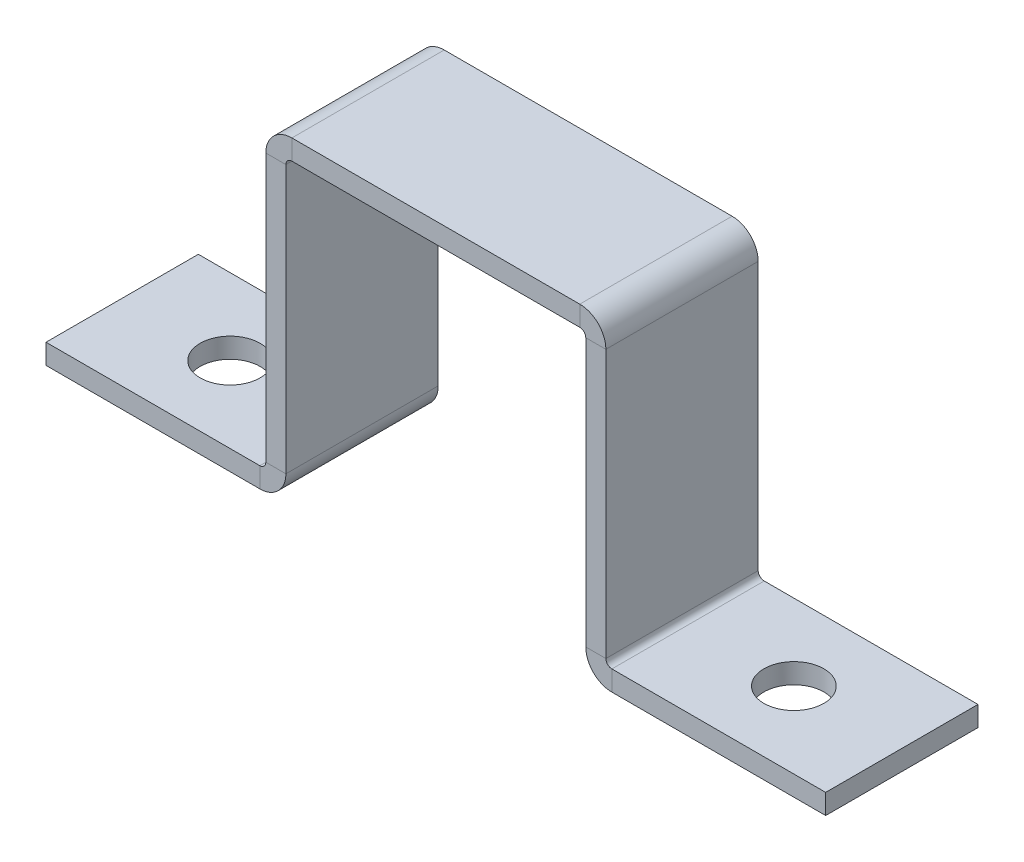
ISO-10303-21;
HEADER;
FILE_DESCRIPTION(('STEP AP214'),'2;1');
FILE_NAME('part.step','',(''),(''),'','','');
FILE_SCHEMA(('AUTOMOTIVE_DESIGN { 1 0 10303 214 1 1 1 1 }'));
ENDSEC;
DATA;
#1=APPLICATION_CONTEXT('core data for automotive mechanical design processes');
#2=APPLICATION_PROTOCOL_DEFINITION('international standard','automotive_design',2000,#1);
#3=PRODUCT_CONTEXT('',#1,'mechanical');
#4=PRODUCT('Part','Part','',(#3));
#5=PRODUCT_RELATED_PRODUCT_CATEGORY('part','',(#4));
#6=PRODUCT_DEFINITION_FORMATION('','',#4);
#7=PRODUCT_DEFINITION_CONTEXT('part definition',#1,'design');
#8=PRODUCT_DEFINITION('design','',#6,#7);
#9=PRODUCT_DEFINITION_SHAPE('','',#8);
#10=(LENGTH_UNIT() NAMED_UNIT(*) SI_UNIT(.MILLI.,.METRE.));
#11=(NAMED_UNIT(*) PLANE_ANGLE_UNIT() SI_UNIT($,.RADIAN.));
#12=(NAMED_UNIT(*) SI_UNIT($,.STERADIAN.) SOLID_ANGLE_UNIT());
#13=UNCERTAINTY_MEASURE_WITH_UNIT(LENGTH_MEASURE(1.E-05),#10,'distance_accuracy_value','');
#14=(GEOMETRIC_REPRESENTATION_CONTEXT(3) GLOBAL_UNCERTAINTY_ASSIGNED_CONTEXT((#13)) GLOBAL_UNIT_ASSIGNED_CONTEXT((#10,
#11,#12)) REPRESENTATION_CONTEXT('',''));
#15=CARTESIAN_POINT('',(0.,0.,0.));
#16=DIRECTION('',(0.,0.,1.));
#17=DIRECTION('',(1.,0.,0.));
#18=AXIS2_PLACEMENT_3D('',#15,#16,#17);
#19=CARTESIAN_POINT('',(29.3500000000001,0.,-12.7));
#20=DIRECTION('',(0.,0.,-1.));
#21=DIRECTION('',(-1.,0.,0.));
#22=AXIS2_PLACEMENT_3D('',#19,#20,#21);
#23=PLANE('',#22);
#24=DIRECTION('',(0.,1.,0.));
#25=VECTOR('',#24,1.);
#26=CARTESIAN_POINT('',(29.3500000000001,0.,-12.7));
#27=LINE('',#26,#25);
#28=CARTESIAN_POINT('',(29.3500000000001,0.,-12.7));
#29=VERTEX_POINT('',#28);
#30=CARTESIAN_POINT('',(29.3500000000001,3.35000000000001,-12.7));
#31=VERTEX_POINT('',#30);
#32=EDGE_CURVE('E11',#29,#31,#27,.T.);
#33=ORIENTED_EDGE('',*,*,#32,.F.);
#34=CARTESIAN_POINT('',(29.3500000000001,4.35000000000001,-12.7));
#35=DIRECTION('',(0.,0.,1.));
#36=DIRECTION('',(1.,0.,0.));
#37=AXIS2_PLACEMENT_3D('',#34,#35,#36);
#38=CIRCLE('',#37,4.35);
#39=CARTESIAN_POINT('',(25.0000000000001,4.35000000000002,-12.7));
#40=VERTEX_POINT('',#39);
#41=EDGE_CURVE('E366',#29,#40,#38,.F.);
#42=ORIENTED_EDGE('',*,*,#41,.T.);
#43=DIRECTION('',(-1.,0.,0.));
#44=VECTOR('',#43,1.);
#45=CARTESIAN_POINT('',(28.3500000000001,4.34999999999991,-12.7));
#46=LINE('',#45,#44);
#47=CARTESIAN_POINT('',(28.3500000000001,4.34999999999991,-12.7));
#48=VERTEX_POINT('',#47);
#49=EDGE_CURVE('E42',#48,#40,#46,.T.);
#50=ORIENTED_EDGE('',*,*,#49,.F.);
#51=CARTESIAN_POINT('',(29.3500000000001,4.35000000000001,-12.7));
#52=DIRECTION('',(0.,0.,1.));
#53=DIRECTION('',(1.,0.,0.));
#54=AXIS2_PLACEMENT_3D('',#51,#52,#53);
#55=CIRCLE('',#54,1.);
#56=EDGE_CURVE('E391',#31,#48,#55,.F.);
#57=ORIENTED_EDGE('',*,*,#56,.F.);
#58=EDGE_LOOP('',(#33,#42,#50,#57));
#59=FACE_BOUND('',#58,.T.);
#60=ADVANCED_FACE('F34',(#59),#23,.T.);
#61=CARTESIAN_POINT('',(28.3500000000001,4.34999999999991,-12.7));
#62=DIRECTION('',(0.,0.,-1.));
#63=DIRECTION('',(-1.,0.,0.));
#64=AXIS2_PLACEMENT_3D('',#61,#62,#63);
#65=PLANE('',#64);
#66=DIRECTION('',(-1.,0.,0.));
#67=VECTOR('',#66,1.);
#68=CARTESIAN_POINT('',(25.0000000000001,0.,-12.7));
#69=LINE('',#68,#67);
#70=CARTESIAN_POINT('',(65.0000000000003,0.,-12.7));
#71=VERTEX_POINT('',#70);
#72=EDGE_CURVE('E370',#71,#29,#69,.T.);
#73=ORIENTED_EDGE('',*,*,#72,.T.);
#74=ORIENTED_EDGE('',*,*,#32,.T.);
#75=DIRECTION('',(-1.,0.,0.));
#76=VECTOR('',#75,1.);
#77=CARTESIAN_POINT('',(25.0000000000001,3.34999999999999,-12.7));
#78=LINE('',#77,#76);
#79=CARTESIAN_POINT('',(65.0000000000001,3.35000000000001,-12.7));
#80=VERTEX_POINT('',#79);
#81=EDGE_CURVE('E388',#80,#31,#78,.T.);
#82=ORIENTED_EDGE('',*,*,#81,.F.);
#83=DIRECTION('',(0.,-1.,0.));
#84=VECTOR('',#83,1.);
#85=CARTESIAN_POINT('',(65.0000000000001,3.35000000000001,-12.7));
#86=LINE('',#85,#84);
#87=EDGE_CURVE('E386',#80,#71,#86,.T.);
#88=ORIENTED_EDGE('',*,*,#87,.T.);
#89=EDGE_LOOP('',(#73,#74,#82,#88));
#90=FACE_BOUND('',#89,.T.);
#91=ADVANCED_FACE('F416',(#90),#65,.T.);
#92=CARTESIAN_POINT('',(25.0000000000001,4.35000000000002,12.7));
#93=DIRECTION('',(0.,0.,1.));
#94=DIRECTION('',(1.,0.,0.));
#95=AXIS2_PLACEMENT_3D('',#92,#93,#94);
#96=PLANE('',#95);
#97=DIRECTION('',(1.,0.,0.));
#98=VECTOR('',#97,1.);
#99=CARTESIAN_POINT('',(25.0000000000001,4.35000000000002,12.7));
#100=LINE('',#99,#98);
#101=CARTESIAN_POINT('',(25.0000000000001,4.35000000000002,12.7));
#102=VERTEX_POINT('',#101);
#103=CARTESIAN_POINT('',(28.3500000000001,4.34999999999991,12.7));
#104=VERTEX_POINT('',#103);
#105=EDGE_CURVE('E350',#102,#104,#100,.T.);
#106=ORIENTED_EDGE('',*,*,#105,.F.);
#107=CARTESIAN_POINT('',(29.3500000000001,4.35000000000013,12.7));
#108=DIRECTION('',(0.,0.,1.));
#109=DIRECTION('',(1.,0.,0.));
#110=AXIS2_PLACEMENT_3D('',#107,#108,#109);
#111=CIRCLE('',#110,4.35);
#112=CARTESIAN_POINT('',(29.3500000000001,1.2490009027033E-13,12.7));
#113=VERTEX_POINT('',#112);
#114=EDGE_CURVE('E254',#113,#102,#111,.F.);
#115=ORIENTED_EDGE('',*,*,#114,.F.);
#116=DIRECTION('',(0.,-1.,0.));
#117=VECTOR('',#116,1.);
#118=CARTESIAN_POINT('',(29.3500000000001,3.35000000000013,12.7));
#119=LINE('',#118,#117);
#120=CARTESIAN_POINT('',(29.3500000000001,3.35000000000013,12.7));
#121=VERTEX_POINT('',#120);
#122=EDGE_CURVE('E348',#121,#113,#119,.T.);
#123=ORIENTED_EDGE('',*,*,#122,.F.);
#124=CARTESIAN_POINT('',(29.3500000000001,4.35000000000013,12.7));
#125=DIRECTION('',(0.,0.,1.));
#126=DIRECTION('',(1.,0.,0.));
#127=AXIS2_PLACEMENT_3D('',#124,#125,#126);
#128=CIRCLE('',#127,1.);
#129=EDGE_CURVE('E265',#121,#104,#128,.F.);
#130=ORIENTED_EDGE('',*,*,#129,.T.);
#131=EDGE_LOOP('',(#106,#115,#123,#130));
#132=FACE_BOUND('',#131,.T.);
#133=ADVANCED_FACE('F424',(#132),#96,.T.);
#134=CARTESIAN_POINT('',(29.3500000000001,3.35000000000013,12.7));
#135=DIRECTION('',(0.,0.,1.));
#136=DIRECTION('',(1.,0.,0.));
#137=AXIS2_PLACEMENT_3D('',#134,#135,#136);
#138=PLANE('',#137);
#139=DIRECTION('',(0.,1.,0.));
#140=VECTOR('',#139,1.);
#141=CARTESIAN_POINT('',(25.0000000000001,50.,12.7));
#142=LINE('',#141,#140);
#143=CARTESIAN_POINT('',(25.0000000000001,49.,12.7));
#144=VERTEX_POINT('',#143);
#145=EDGE_CURVE('E251',#102,#144,#142,.T.);
#146=ORIENTED_EDGE('',*,*,#145,.F.);
#147=ORIENTED_EDGE('',*,*,#105,.T.);
#148=DIRECTION('',(0.,1.,0.));
#149=VECTOR('',#148,1.);
#150=CARTESIAN_POINT('',(28.3500000000001,50.,12.7));
#151=LINE('',#150,#149);
#152=CARTESIAN_POINT('',(28.3500000000001,49.,12.7));
#153=VERTEX_POINT('',#152);
#154=EDGE_CURVE('E268',#104,#153,#151,.T.);
#155=ORIENTED_EDGE('',*,*,#154,.T.);
#156=DIRECTION('',(-1.,0.,0.));
#157=VECTOR('',#156,1.);
#158=CARTESIAN_POINT('',(28.3500000000001,49.,12.7));
#159=LINE('',#158,#157);
#160=EDGE_CURVE('E340',#153,#144,#159,.T.);
#161=ORIENTED_EDGE('',*,*,#160,.T.);
#162=EDGE_LOOP('',(#146,#147,#155,#161));
#163=FACE_BOUND('',#162,.T.);
#164=ADVANCED_FACE('F426',(#163),#138,.T.);
#165=CARTESIAN_POINT('',(25.0000000000001,49.,-12.7));
#166=DIRECTION('',(0.,0.,-1.));
#167=DIRECTION('',(-1.,0.,0.));
#168=AXIS2_PLACEMENT_3D('',#165,#166,#167);
#169=PLANE('',#168);
#170=DIRECTION('',(1.,0.,0.));
#171=VECTOR('',#170,1.);
#172=CARTESIAN_POINT('',(25.0000000000001,49.,-12.7));
#173=LINE('',#172,#171);
#174=CARTESIAN_POINT('',(25.0000000000001,49.,-12.7));
#175=VERTEX_POINT('',#174);
#176=CARTESIAN_POINT('',(28.3500000000001,49.,-12.7));
#177=VERTEX_POINT('',#176);
#178=EDGE_CURVE('E346',#175,#177,#173,.T.);
#179=ORIENTED_EDGE('',*,*,#178,.F.);
#180=CARTESIAN_POINT('',(24.0000000000001,49.,-12.7));
#181=DIRECTION('',(0.,0.,-1.));
#182=DIRECTION('',(-1.,0.,0.));
#183=AXIS2_PLACEMENT_3D('',#180,#181,#182);
#184=CIRCLE('',#183,1.);
#185=CARTESIAN_POINT('',(24.0000000000001,50.,-12.7));
#186=VERTEX_POINT('',#185);
#187=EDGE_CURVE('E378',#175,#186,#184,.F.);
#188=ORIENTED_EDGE('',*,*,#187,.T.);
#189=DIRECTION('',(0.,-1.,0.));
#190=VECTOR('',#189,1.);
#191=CARTESIAN_POINT('',(24.0000000000001,53.35,-12.7));
#192=LINE('',#191,#190);
#193=CARTESIAN_POINT('',(24.0000000000001,53.35,-12.7));
#194=VERTEX_POINT('',#193);
#195=EDGE_CURVE('E344',#194,#186,#192,.T.);
#196=ORIENTED_EDGE('',*,*,#195,.F.);
#197=CARTESIAN_POINT('',(24.0000000000001,49.,-12.7));
#198=DIRECTION('',(0.,0.,1.));
#199=DIRECTION('',(1.,0.,0.));
#200=AXIS2_PLACEMENT_3D('',#197,#198,#199);
#201=CIRCLE('',#200,4.35);
#202=EDGE_CURVE('E221',#177,#194,#201,.T.);
#203=ORIENTED_EDGE('',*,*,#202,.F.);
#204=EDGE_LOOP('',(#179,#188,#196,#203));
#205=FACE_BOUND('',#204,.T.);
#206=ADVANCED_FACE('F402',(#205),#169,.T.);
#207=CARTESIAN_POINT('',(24.0000000000001,53.35,-12.7));
#208=DIRECTION('',(0.,0.,-1.));
#209=DIRECTION('',(-1.,0.,0.));
#210=AXIS2_PLACEMENT_3D('',#207,#208,#209);
#211=PLANE('',#210);
#212=DIRECTION('',(0.,1.,0.));
#213=VECTOR('',#212,1.);
#214=CARTESIAN_POINT('',(25.0000000000001,50.,-12.7));
#215=LINE('',#214,#213);
#216=EDGE_CURVE('E357',#40,#175,#215,.T.);
#217=ORIENTED_EDGE('',*,*,#216,.T.);
#218=ORIENTED_EDGE('',*,*,#178,.T.);
#219=DIRECTION('',(0.,1.,0.));
#220=VECTOR('',#219,1.);
#221=CARTESIAN_POINT('',(28.3500000000001,50.,-12.7));
#222=LINE('',#221,#220);
#223=EDGE_CURVE('E360',#48,#177,#222,.T.);
#224=ORIENTED_EDGE('',*,*,#223,.F.);
#225=ORIENTED_EDGE('',*,*,#49,.T.);
#226=EDGE_LOOP('',(#217,#218,#224,#225));
#227=FACE_BOUND('',#226,.T.);
#228=ADVANCED_FACE('F355',(#227),#211,.T.);
#229=CARTESIAN_POINT('',(24.0000000000001,50.,12.7));
#230=DIRECTION('',(0.,0.,1.));
#231=DIRECTION('',(1.,0.,0.));
#232=AXIS2_PLACEMENT_3D('',#229,#230,#231);
#233=PLANE('',#232);
#234=DIRECTION('',(0.,1.,0.));
#235=VECTOR('',#234,1.);
#236=CARTESIAN_POINT('',(24.0000000000001,50.,12.7));
#237=LINE('',#236,#235);
#238=CARTESIAN_POINT('',(24.0000000000001,50.,12.7));
#239=VERTEX_POINT('',#238);
#240=CARTESIAN_POINT('',(24.0000000000001,53.35,12.7));
#241=VERTEX_POINT('',#240);
#242=EDGE_CURVE('E342',#239,#241,#237,.T.);
#243=ORIENTED_EDGE('',*,*,#242,.F.);
#244=CARTESIAN_POINT('',(24.0000000000001,49.,12.7));
#245=DIRECTION('',(0.,0.,-1.));
#246=DIRECTION('',(-1.,0.,0.));
#247=AXIS2_PLACEMENT_3D('',#244,#245,#246);
#248=CIRCLE('',#247,1.);
#249=EDGE_CURVE('E248',#144,#239,#248,.F.);
#250=ORIENTED_EDGE('',*,*,#249,.F.);
#251=ORIENTED_EDGE('',*,*,#160,.F.);
#252=CARTESIAN_POINT('',(24.0000000000001,49.,12.7));
#253=DIRECTION('',(0.,0.,1.));
#254=DIRECTION('',(1.,0.,0.));
#255=AXIS2_PLACEMENT_3D('',#252,#253,#254);
#256=CIRCLE('',#255,4.35);
#257=EDGE_CURVE('E271',#153,#241,#256,.T.);
#258=ORIENTED_EDGE('',*,*,#257,.T.);
#259=EDGE_LOOP('',(#243,#250,#251,#258));
#260=FACE_BOUND('',#259,.T.);
#261=ADVANCED_FACE('F432',(#260),#233,.T.);
#262=CARTESIAN_POINT('',(28.3500000000001,49.,12.7));
#263=DIRECTION('',(0.,0.,1.));
#264=DIRECTION('',(1.,0.,0.));
#265=AXIS2_PLACEMENT_3D('',#262,#263,#264);
#266=PLANE('',#265);
#267=DIRECTION('',(-1.,0.,0.));
#268=VECTOR('',#267,1.);
#269=CARTESIAN_POINT('',(-25.0000000000002,50.,12.7000000000001));
#270=LINE('',#269,#268);
#271=CARTESIAN_POINT('',(-24.0000000000002,50.,12.7));
#272=VERTEX_POINT('',#271);
#273=EDGE_CURVE('E245',#239,#272,#270,.T.);
#274=ORIENTED_EDGE('',*,*,#273,.F.);
#275=ORIENTED_EDGE('',*,*,#242,.T.);
#276=DIRECTION('',(1.,0.,0.));
#277=VECTOR('',#276,1.);
#278=CARTESIAN_POINT('',(-25.0000000000002,53.35,12.7000000000001));
#279=LINE('',#278,#277);
#280=CARTESIAN_POINT('',(-24.0000000000002,53.35,12.7));
#281=VERTEX_POINT('',#280);
#282=EDGE_CURVE('E274',#241,#281,#279,.F.);
#283=ORIENTED_EDGE('',*,*,#282,.T.);
#284=DIRECTION('',(0.,-1.,0.));
#285=VECTOR('',#284,1.);
#286=CARTESIAN_POINT('',(-24.0000000000002,53.35,12.7));
#287=LINE('',#286,#285);
#288=EDGE_CURVE('E336',#281,#272,#287,.T.);
#289=ORIENTED_EDGE('',*,*,#288,.T.);
#290=EDGE_LOOP('',(#274,#275,#283,#289));
#291=FACE_BOUND('',#290,.T.);
#292=ADVANCED_FACE('F435',(#291),#266,.T.);
#293=CARTESIAN_POINT('',(-24.0000000000001,50.,-12.7));
#294=DIRECTION('',(0.,0.,-1.));
#295=DIRECTION('',(-1.,0.,0.));
#296=AXIS2_PLACEMENT_3D('',#293,#294,#295);
#297=PLANE('',#296);
#298=DIRECTION('',(0.,1.,0.));
#299=VECTOR('',#298,1.);
#300=CARTESIAN_POINT('',(-24.0000000000001,50.,-12.7));
#301=LINE('',#300,#299);
#302=CARTESIAN_POINT('',(-24.0000000000001,50.,-12.7));
#303=VERTEX_POINT('',#302);
#304=CARTESIAN_POINT('',(-24.0000000000002,53.35,-12.7));
#305=VERTEX_POINT('',#304);
#306=EDGE_CURVE('E193',#303,#305,#301,.T.);
#307=ORIENTED_EDGE('',*,*,#306,.F.);
#308=CARTESIAN_POINT('',(-24.0000000000001,49.,-12.7));
#309=DIRECTION('',(0.,0.,-1.));
#310=DIRECTION('',(-1.,0.,0.));
#311=AXIS2_PLACEMENT_3D('',#308,#309,#310);
#312=CIRCLE('',#311,1.);
#313=CARTESIAN_POINT('',(-25.0000000000001,49.,-12.6999999999999));
#314=VERTEX_POINT('',#313);
#315=EDGE_CURVE('E188',#303,#314,#312,.F.);
#316=ORIENTED_EDGE('',*,*,#315,.T.);
#317=DIRECTION('',(1.,0.,0.));
#318=VECTOR('',#317,1.);
#319=CARTESIAN_POINT('',(-28.3500000000001,48.9999999999998,-12.6999999999999));
#320=LINE('',#319,#318);
#321=CARTESIAN_POINT('',(-28.3500000000001,48.9999999999998,-12.6999999999999));
#322=VERTEX_POINT('',#321);
#323=EDGE_CURVE('E181',#322,#314,#320,.T.);
#324=ORIENTED_EDGE('',*,*,#323,.F.);
#325=CARTESIAN_POINT('',(-24.0000000000001,49.,-12.7));
#326=DIRECTION('',(0.,0.,1.));
#327=DIRECTION('',(1.,0.,0.));
#328=AXIS2_PLACEMENT_3D('',#325,#326,#327);
#329=CIRCLE('',#328,4.35);
#330=EDGE_CURVE('E185',#305,#322,#329,.T.);
#331=ORIENTED_EDGE('',*,*,#330,.F.);
#332=EDGE_LOOP('',(#307,#316,#324,#331));
#333=FACE_BOUND('',#332,.T.);
#334=ADVANCED_FACE('F183',(#333),#297,.T.);
#335=CARTESIAN_POINT('',(-28.3500000000001,48.9999999999998,-12.6999999999999));
#336=DIRECTION('',(0.,0.,-1.));
#337=DIRECTION('',(-1.,0.,0.));
#338=AXIS2_PLACEMENT_3D('',#335,#336,#337);
#339=PLANE('',#338);
#340=DIRECTION('',(-1.,0.,0.));
#341=VECTOR('',#340,1.);
#342=CARTESIAN_POINT('',(-25.0000000000001,50.,-12.6999999999999));
#343=LINE('',#342,#341);
#344=EDGE_CURVE('E381',#186,#303,#343,.T.);
#345=ORIENTED_EDGE('',*,*,#344,.T.);
#346=ORIENTED_EDGE('',*,*,#306,.T.);
#347=DIRECTION('',(1.,0.,0.));
#348=VECTOR('',#347,1.);
#349=CARTESIAN_POINT('',(-25.0000000000002,53.35,-12.6999999999999));
#350=LINE('',#349,#348);
#351=EDGE_CURVE('E219',#194,#305,#350,.F.);
#352=ORIENTED_EDGE('',*,*,#351,.F.);
#353=ORIENTED_EDGE('',*,*,#195,.T.);
#354=EDGE_LOOP('',(#345,#346,#352,#353));
#355=FACE_BOUND('',#354,.T.);
#356=ADVANCED_FACE('F483',(#355),#339,.T.);
#357=CARTESIAN_POINT('',(-25.0000000000002,49.,12.7000000000001));
#358=DIRECTION('',(0.,0.,1.));
#359=DIRECTION('',(1.,0.,0.));
#360=AXIS2_PLACEMENT_3D('',#357,#358,#359);
#361=PLANE('',#360);
#362=DIRECTION('',(-1.,0.,0.));
#363=VECTOR('',#362,1.);
#364=CARTESIAN_POINT('',(-25.0000000000002,49.,12.7000000000001));
#365=LINE('',#364,#363);
#366=CARTESIAN_POINT('',(-25.0000000000002,49.,12.7000000000001));
#367=VERTEX_POINT('',#366);
#368=CARTESIAN_POINT('',(-28.3500000000002,49.,12.7000000000003));
#369=VERTEX_POINT('',#368);
#370=EDGE_CURVE('E194',#367,#369,#365,.T.);
#371=ORIENTED_EDGE('',*,*,#370,.F.);
#372=CARTESIAN_POINT('',(-24.0000000000002,49.,12.7));
#373=DIRECTION('',(0.,0.,-1.));
#374=DIRECTION('',(-1.,0.,0.));
#375=AXIS2_PLACEMENT_3D('',#372,#373,#374);
#376=CIRCLE('',#375,1.);
#377=EDGE_CURVE('E242',#272,#367,#376,.F.);
#378=ORIENTED_EDGE('',*,*,#377,.F.);
#379=ORIENTED_EDGE('',*,*,#288,.F.);
#380=CARTESIAN_POINT('',(-24.0000000000002,49.,12.7));
#381=DIRECTION('',(0.,0.,1.));
#382=DIRECTION('',(1.,0.,0.));
#383=AXIS2_PLACEMENT_3D('',#380,#381,#382);
#384=CIRCLE('',#383,4.35);
#385=EDGE_CURVE('E277',#281,#369,#384,.T.);
#386=ORIENTED_EDGE('',*,*,#385,.T.);
#387=EDGE_LOOP('',(#371,#378,#379,#386));
#388=FACE_BOUND('',#387,.T.);
#389=ADVANCED_FACE('F444',(#388),#361,.T.);
#390=CARTESIAN_POINT('',(-24.0000000000002,53.35,12.7));
#391=DIRECTION('',(0.,0.,1.));
#392=DIRECTION('',(1.,0.,0.));
#393=AXIS2_PLACEMENT_3D('',#390,#391,#392);
#394=PLANE('',#393);
#395=DIRECTION('',(0.,-1.,0.));
#396=VECTOR('',#395,1.);
#397=CARTESIAN_POINT('',(-25.0000000000002,50.,12.7000000000001));
#398=LINE('',#397,#396);
#399=CARTESIAN_POINT('',(-25.0000000000001,4.34999999999998,12.7));
#400=VERTEX_POINT('',#399);
#401=EDGE_CURVE('E239',#367,#400,#398,.T.);
#402=ORIENTED_EDGE('',*,*,#401,.F.);
#403=ORIENTED_EDGE('',*,*,#370,.T.);
#404=DIRECTION('',(0.,-1.,0.));
#405=VECTOR('',#404,1.);
#406=CARTESIAN_POINT('',(-28.3500000000002,50.,12.7000000000003));
#407=LINE('',#406,#405);
#408=CARTESIAN_POINT('',(-28.3500000000002,4.34999999999999,12.7));
#409=VERTEX_POINT('',#408);
#410=EDGE_CURVE('E204',#369,#409,#407,.T.);
#411=ORIENTED_EDGE('',*,*,#410,.T.);
#412=DIRECTION('',(1.,0.,0.));
#413=VECTOR('',#412,1.);
#414=CARTESIAN_POINT('',(-28.3500000000002,4.34999999999999,12.7));
#415=LINE('',#414,#413);
#416=EDGE_CURVE('E115',#409,#400,#415,.T.);
#417=ORIENTED_EDGE('',*,*,#416,.T.);
#418=EDGE_LOOP('',(#402,#403,#411,#417));
#419=FACE_BOUND('',#418,.T.);
#420=ADVANCED_FACE('F447',(#419),#394,.T.);
#421=CARTESIAN_POINT('',(-25.0000000000001,4.34999999999998,-12.7));
#422=DIRECTION('',(0.,0.,-1.));
#423=DIRECTION('',(-1.,0.,0.));
#424=AXIS2_PLACEMENT_3D('',#421,#422,#423);
#425=PLANE('',#424);
#426=DIRECTION('',(-1.,0.,0.));
#427=VECTOR('',#426,1.);
#428=CARTESIAN_POINT('',(-25.0000000000001,4.34999999999998,-12.7));
#429=LINE('',#428,#427);
#430=CARTESIAN_POINT('',(-25.0000000000001,4.34999999999998,-12.7));
#431=VERTEX_POINT('',#430);
#432=CARTESIAN_POINT('',(-28.3500000000001,4.34999999999999,-12.7));
#433=VERTEX_POINT('',#432);
#434=EDGE_CURVE('E212',#431,#433,#429,.T.);
#435=ORIENTED_EDGE('',*,*,#434,.F.);
#436=CARTESIAN_POINT('',(-29.3500000000001,4.34999999999999,-12.7));
#437=DIRECTION('',(0.,0.,1.));
#438=DIRECTION('',(1.,0.,0.));
#439=AXIS2_PLACEMENT_3D('',#436,#437,#438);
#440=CIRCLE('',#439,4.35);
#441=CARTESIAN_POINT('',(-29.3500000000001,0.,-12.7));
#442=VERTEX_POINT('',#441);
#443=EDGE_CURVE('E457',#431,#442,#440,.F.);
#444=ORIENTED_EDGE('',*,*,#443,.T.);
#445=DIRECTION('',(0.,-1.,0.));
#446=VECTOR('',#445,1.);
#447=CARTESIAN_POINT('',(-29.3500000000001,3.34999999999999,-12.7));
#448=LINE('',#447,#446);
#449=CARTESIAN_POINT('',(-29.3500000000001,3.34999999999999,-12.7));
#450=VERTEX_POINT('',#449);
#451=EDGE_CURVE('E50',#450,#442,#448,.T.);
#452=ORIENTED_EDGE('',*,*,#451,.F.);
#453=CARTESIAN_POINT('',(-29.3500000000001,4.34999999999999,-12.7));
#454=DIRECTION('',(0.,0.,1.));
#455=DIRECTION('',(1.,0.,0.));
#456=AXIS2_PLACEMENT_3D('',#453,#454,#455);
#457=CIRCLE('',#456,1.);
#458=EDGE_CURVE('E214',#433,#450,#457,.F.);
#459=ORIENTED_EDGE('',*,*,#458,.F.);
#460=EDGE_LOOP('',(#435,#444,#452,#459));
#461=FACE_BOUND('',#460,.T.);
#462=ADVANCED_FACE('F522',(#461),#425,.T.);
#463=CARTESIAN_POINT('',(-29.3500000000001,3.34999999999999,-12.7));
#464=DIRECTION('',(0.,0.,-1.));
#465=DIRECTION('',(-1.,0.,0.));
#466=AXIS2_PLACEMENT_3D('',#463,#464,#465);
#467=PLANE('',#466);
#468=DIRECTION('',(0.,-1.,0.));
#469=VECTOR('',#468,1.);
#470=CARTESIAN_POINT('',(-25.0000000000001,50.,-12.6999999999999));
#471=LINE('',#470,#469);
#472=EDGE_CURVE('E475',#314,#431,#471,.T.);
#473=ORIENTED_EDGE('',*,*,#472,.T.);
#474=ORIENTED_EDGE('',*,*,#434,.T.);
#475=DIRECTION('',(0.,-1.,0.));
#476=VECTOR('',#475,1.);
#477=CARTESIAN_POINT('',(-28.3500000000001,49.9999999999998,-12.6999999999999));
#478=LINE('',#477,#476);
#479=EDGE_CURVE('E202',#322,#433,#478,.T.);
#480=ORIENTED_EDGE('',*,*,#479,.F.);
#481=ORIENTED_EDGE('',*,*,#323,.T.);
#482=EDGE_LOOP('',(#473,#474,#480,#481));
#483=FACE_BOUND('',#482,.T.);
#484=ADVANCED_FACE('F211',(#483),#467,.T.);
#485=CARTESIAN_POINT('',(-29.3500000000002,0.,12.7));
#486=DIRECTION('',(0.,0.,1.));
#487=DIRECTION('',(1.,0.,0.));
#488=AXIS2_PLACEMENT_3D('',#485,#486,#487);
#489=PLANE('',#488);
#490=DIRECTION('',(0.,1.,0.));
#491=VECTOR('',#490,1.);
#492=CARTESIAN_POINT('',(-29.3500000000002,0.,12.7));
#493=LINE('',#492,#491);
#494=CARTESIAN_POINT('',(-29.3500000000002,0.,12.7));
#495=VERTEX_POINT('',#494);
#496=CARTESIAN_POINT('',(-29.3500000000002,3.34999999999999,12.7));
#497=VERTEX_POINT('',#496);
#498=EDGE_CURVE('E122',#495,#497,#493,.T.);
#499=ORIENTED_EDGE('',*,*,#498,.F.);
#500=CARTESIAN_POINT('',(-29.3500000000002,4.34999999999999,12.7));
#501=DIRECTION('',(0.,0.,1.));
#502=DIRECTION('',(1.,0.,0.));
#503=AXIS2_PLACEMENT_3D('',#500,#501,#502);
#504=CIRCLE('',#503,4.35);
#505=EDGE_CURVE('E236',#400,#495,#504,.F.);
#506=ORIENTED_EDGE('',*,*,#505,.F.);
#507=ORIENTED_EDGE('',*,*,#416,.F.);
#508=CARTESIAN_POINT('',(-29.3500000000002,4.34999999999999,12.7));
#509=DIRECTION('',(0.,0.,1.));
#510=DIRECTION('',(1.,0.,0.));
#511=AXIS2_PLACEMENT_3D('',#508,#509,#510);
#512=CIRCLE('',#511,1.);
#513=EDGE_CURVE('E280',#409,#497,#512,.F.);
#514=ORIENTED_EDGE('',*,*,#513,.T.);
#515=EDGE_LOOP('',(#499,#506,#507,#514));
#516=FACE_BOUND('',#515,.T.);
#517=ADVANCED_FACE('F458',(#516),#489,.T.);
#518=CARTESIAN_POINT('',(-28.3500000000002,4.34999999999999,12.7));
#519=DIRECTION('',(0.,0.,1.));
#520=DIRECTION('',(1.,0.,0.));
#521=AXIS2_PLACEMENT_3D('',#518,#519,#520);
#522=PLANE('',#521);
#523=DIRECTION('',(-1.,0.,0.));
#524=VECTOR('',#523,1.);
#525=CARTESIAN_POINT('',(-25.0000000000001,0.,12.7));
#526=LINE('',#525,#524);
#527=CARTESIAN_POINT('',(-65.0000000000003,0.,12.7));
#528=VERTEX_POINT('',#527);
#529=EDGE_CURVE('E234',#495,#528,#526,.T.);
#530=ORIENTED_EDGE('',*,*,#529,.F.);
#531=ORIENTED_EDGE('',*,*,#498,.T.);
#532=DIRECTION('',(-1.,0.,0.));
#533=VECTOR('',#532,1.);
#534=CARTESIAN_POINT('',(-25.0000000000001,3.35000000000001,12.7));
#535=LINE('',#534,#533);
#536=CARTESIAN_POINT('',(-65.0000000000004,3.34999999999998,12.7));
#537=VERTEX_POINT('',#536);
#538=EDGE_CURVE('E228',#497,#537,#535,.T.);
#539=ORIENTED_EDGE('',*,*,#538,.T.);
#540=DIRECTION('',(0.,1.,0.));
#541=VECTOR('',#540,1.);
#542=CARTESIAN_POINT('',(-65.0000000000003,0.,12.7));
#543=LINE('',#542,#541);
#544=EDGE_CURVE('E230',#528,#537,#543,.T.);
#545=ORIENTED_EDGE('',*,*,#544,.F.);
#546=EDGE_LOOP('',(#530,#531,#539,#545));
#547=FACE_BOUND('',#546,.T.);
#548=ADVANCED_FACE('F466',(#547),#522,.T.);
#549=CARTESIAN_POINT('',(-25.0000000000001,3.34999999999999,-12.7));
#550=DIRECTION('',(0.,1.,0.));
#551=DIRECTION('',(-1.,0.,0.));
#552=AXIS2_PLACEMENT_3D('',#549,#550,#551);
#553=PLANE('',#552);
#554=CARTESIAN_POINT('',(-47.0000000000002,3.34999999999999,0.));
#555=DIRECTION('',(0.,1.,0.));
#556=DIRECTION('',(-1.,0.,0.));
#557=AXIS2_PLACEMENT_3D('',#554,#555,#556);
#558=CIRCLE('',#557,5.);
#559=CARTESIAN_POINT('',(-52.0000000000002,3.34999999999999,0.));
#560=VERTEX_POINT('',#559);
#561=EDGE_CURVE('E902',#560,#560,#558,.T.);
#562=ORIENTED_EDGE('',*,*,#561,.F.);
#563=EDGE_LOOP('',(#562));
#564=FACE_BOUND('',#563,.T.);
#565=ORIENTED_EDGE('',*,*,#538,.F.);
#566=DIRECTION('',(0.,0.,1.));
#567=VECTOR('',#566,1.);
#568=CARTESIAN_POINT('',(-29.3500000000001,3.34999999999999,-12.7));
#569=LINE('',#568,#567);
#570=EDGE_CURVE('E283',#450,#497,#569,.T.);
#571=ORIENTED_EDGE('',*,*,#570,.F.);
#572=DIRECTION('',(-1.,0.,0.));
#573=VECTOR('',#572,1.);
#574=CARTESIAN_POINT('',(-25.0000000000001,3.34999999999999,-12.7));
#575=LINE('',#574,#573);
#576=CARTESIAN_POINT('',(-65.0000000000004,3.34999999999999,-12.7));
#577=VERTEX_POINT('',#576);
#578=EDGE_CURVE('E282',#450,#577,#575,.T.);
#579=ORIENTED_EDGE('',*,*,#578,.T.);
#580=DIRECTION('',(0.,0.,1.));
#581=VECTOR('',#580,1.);
#582=CARTESIAN_POINT('',(-65.0000000000004,3.34999999999999,-12.7));
#583=LINE('',#582,#581);
#584=EDGE_CURVE('E227',#577,#537,#583,.T.);
#585=ORIENTED_EDGE('',*,*,#584,.T.);
#586=EDGE_LOOP('',(#565,#571,#579,#585));
#587=FACE_BOUND('',#586,.T.);
#588=ADVANCED_FACE('F464',(#564,#587),#553,.T.);
#589=CARTESIAN_POINT('',(-29.3500000000001,4.34999999999999,-12.7));
#590=DIRECTION('',(0.,0.,1.));
#591=DIRECTION('',(1.,0.,0.));
#592=AXIS2_PLACEMENT_3D('',#589,#590,#591);
#593=CYLINDRICAL_SURFACE('',#592,1.);
#594=ORIENTED_EDGE('',*,*,#513,.F.);
#595=DIRECTION('',(0.,0.,1.));
#596=VECTOR('',#595,1.);
#597=CARTESIAN_POINT('',(-28.3500000000001,4.34999999999999,-12.7));
#598=LINE('',#597,#596);
#599=EDGE_CURVE('E208',#433,#409,#598,.T.);
#600=ORIENTED_EDGE('',*,*,#599,.F.);
#601=ORIENTED_EDGE('',*,*,#458,.T.);
#602=ORIENTED_EDGE('',*,*,#570,.T.);
#603=EDGE_LOOP('',(#594,#600,#601,#602));
#604=FACE_BOUND('',#603,.T.);
#605=ADVANCED_FACE('F460',(#604),#593,.F.);
#606=CARTESIAN_POINT('',(-28.3500000000001,49.9999999999998,-12.6999999999999));
#607=DIRECTION('',(-1.,0.,0.));
#608=DIRECTION('',(0.,-1.,0.));
#609=AXIS2_PLACEMENT_3D('',#606,#607,#608);
#610=PLANE('',#609);
#611=ORIENTED_EDGE('',*,*,#410,.F.);
#612=DIRECTION('',(0.,0.,1.));
#613=VECTOR('',#612,1.);
#614=CARTESIAN_POINT('',(-28.3500000000001,48.9999999999998,-12.6999999999999));
#615=LINE('',#614,#613);
#616=EDGE_CURVE('E200',#322,#369,#615,.T.);
#617=ORIENTED_EDGE('',*,*,#616,.F.);
#618=ORIENTED_EDGE('',*,*,#479,.T.);
#619=ORIENTED_EDGE('',*,*,#599,.T.);
#620=EDGE_LOOP('',(#611,#617,#618,#619));
#621=FACE_BOUND('',#620,.T.);
#622=ADVANCED_FACE('F201',(#621),#610,.T.);
#623=CARTESIAN_POINT('',(-24.0000000000001,49.,-12.7));
#624=DIRECTION('',(0.,0.,1.));
#625=DIRECTION('',(1.,0.,0.));
#626=AXIS2_PLACEMENT_3D('',#623,#624,#625);
#627=CYLINDRICAL_SURFACE('',#626,4.35);
#628=ORIENTED_EDGE('',*,*,#385,.F.);
#629=DIRECTION('',(0.,0.,1.));
#630=VECTOR('',#629,1.);
#631=CARTESIAN_POINT('',(-24.0000000000002,53.35,-12.7));
#632=LINE('',#631,#630);
#633=EDGE_CURVE('E209',#305,#281,#632,.T.);
#634=ORIENTED_EDGE('',*,*,#633,.F.);
#635=ORIENTED_EDGE('',*,*,#330,.T.);
#636=ORIENTED_EDGE('',*,*,#616,.T.);
#637=EDGE_LOOP('',(#628,#634,#635,#636));
#638=FACE_BOUND('',#637,.T.);
#639=ADVANCED_FACE('F217',(#638),#627,.T.);
#640=CARTESIAN_POINT('',(-25.0000000000002,53.35,-12.6999999999999));
#641=DIRECTION('',(0.,1.,0.));
#642=DIRECTION('',(0.,0.,1.));
#643=AXIS2_PLACEMENT_3D('',#640,#641,#642);
#644=PLANE('',#643);
#645=ORIENTED_EDGE('',*,*,#282,.F.);
#646=DIRECTION('',(0.,0.,1.));
#647=VECTOR('',#646,1.);
#648=CARTESIAN_POINT('',(24.0000000000001,53.35,-12.7));
#649=LINE('',#648,#647);
#650=EDGE_CURVE('E287',#194,#241,#649,.T.);
#651=ORIENTED_EDGE('',*,*,#650,.F.);
#652=ORIENTED_EDGE('',*,*,#351,.T.);
#653=ORIENTED_EDGE('',*,*,#633,.T.);
#654=EDGE_LOOP('',(#645,#651,#652,#653));
#655=FACE_BOUND('',#654,.T.);
#656=ADVANCED_FACE('F486',(#655),#644,.T.);
#657=CARTESIAN_POINT('',(24.0000000000001,49.,-12.7));
#658=DIRECTION('',(0.,0.,1.));
#659=DIRECTION('',(1.,0.,0.));
#660=AXIS2_PLACEMENT_3D('',#657,#658,#659);
#661=CYLINDRICAL_SURFACE('',#660,4.35);
#662=ORIENTED_EDGE('',*,*,#257,.F.);
#663=DIRECTION('',(0.,0.,1.));
#664=VECTOR('',#663,1.);
#665=CARTESIAN_POINT('',(28.3500000000001,49.,-12.7));
#666=LINE('',#665,#664);
#667=EDGE_CURVE('E290',#177,#153,#666,.T.);
#668=ORIENTED_EDGE('',*,*,#667,.F.);
#669=ORIENTED_EDGE('',*,*,#202,.T.);
#670=ORIENTED_EDGE('',*,*,#650,.T.);
#671=EDGE_LOOP('',(#662,#668,#669,#670));
#672=FACE_BOUND('',#671,.T.);
#673=ADVANCED_FACE('F398',(#672),#661,.T.);
#674=CARTESIAN_POINT('',(28.3500000000001,50.,-12.7));
#675=DIRECTION('',(1.,0.,0.));
#676=DIRECTION('',(0.,1.,0.));
#677=AXIS2_PLACEMENT_3D('',#674,#675,#676);
#678=PLANE('',#677);
#679=ORIENTED_EDGE('',*,*,#154,.F.);
#680=DIRECTION('',(0.,0.,1.));
#681=VECTOR('',#680,1.);
#682=CARTESIAN_POINT('',(28.3500000000001,4.34999999999991,-12.7));
#683=LINE('',#682,#681);
#684=EDGE_CURVE('E293',#48,#104,#683,.T.);
#685=ORIENTED_EDGE('',*,*,#684,.F.);
#686=ORIENTED_EDGE('',*,*,#223,.T.);
#687=ORIENTED_EDGE('',*,*,#667,.T.);
#688=EDGE_LOOP('',(#679,#685,#686,#687));
#689=FACE_BOUND('',#688,.T.);
#690=ADVANCED_FACE('F405',(#689),#678,.T.);
#691=CARTESIAN_POINT('',(29.3500000000001,4.35000000000001,-12.7));
#692=DIRECTION('',(0.,0.,1.));
#693=DIRECTION('',(1.,0.,0.));
#694=AXIS2_PLACEMENT_3D('',#691,#692,#693);
#695=CYLINDRICAL_SURFACE('',#694,1.);
#696=ORIENTED_EDGE('',*,*,#129,.F.);
#697=DIRECTION('',(0.,0.,1.));
#698=VECTOR('',#697,1.);
#699=CARTESIAN_POINT('',(29.3500000000001,3.35000000000001,-12.7));
#700=LINE('',#699,#698);
#701=EDGE_CURVE('E296',#31,#121,#700,.T.);
#702=ORIENTED_EDGE('',*,*,#701,.F.);
#703=ORIENTED_EDGE('',*,*,#56,.T.);
#704=ORIENTED_EDGE('',*,*,#684,.T.);
#705=EDGE_LOOP('',(#696,#702,#703,#704));
#706=FACE_BOUND('',#705,.T.);
#707=ADVANCED_FACE('F408',(#706),#695,.F.);
#708=CARTESIAN_POINT('',(25.0000000000001,3.34999999999999,-12.7));
#709=DIRECTION('',(0.,1.,0.));
#710=DIRECTION('',(-1.,0.,0.));
#711=AXIS2_PLACEMENT_3D('',#708,#709,#710);
#712=PLANE('',#711);
#713=CARTESIAN_POINT('',(47.0000000000003,3.35000000000001,0.));
#714=DIRECTION('',(0.,1.,0.));
#715=DIRECTION('',(-1.,0.,0.));
#716=AXIS2_PLACEMENT_3D('',#713,#714,#715);
#717=CIRCLE('',#716,5.);
#718=CARTESIAN_POINT('',(42.0000000000003,3.35000000000001,0.));
#719=VERTEX_POINT('',#718);
#720=EDGE_CURVE('E231',#719,#719,#717,.T.);
#721=ORIENTED_EDGE('',*,*,#720,.F.);
#722=EDGE_LOOP('',(#721));
#723=FACE_BOUND('',#722,.T.);
#724=DIRECTION('',(-1.,0.,0.));
#725=VECTOR('',#724,1.);
#726=CARTESIAN_POINT('',(25.0000000000001,3.34999999999988,12.7));
#727=LINE('',#726,#725);
#728=CARTESIAN_POINT('',(65.0000000000001,3.34999999999999,12.7));
#729=VERTEX_POINT('',#728);
#730=EDGE_CURVE('E262',#729,#121,#727,.T.);
#731=ORIENTED_EDGE('',*,*,#730,.F.);
#732=DIRECTION('',(0.,0.,1.));
#733=VECTOR('',#732,1.);
#734=CARTESIAN_POINT('',(65.0000000000001,3.35000000000001,-12.7));
#735=LINE('',#734,#733);
#736=EDGE_CURVE('E299',#80,#729,#735,.T.);
#737=ORIENTED_EDGE('',*,*,#736,.F.);
#738=ORIENTED_EDGE('',*,*,#81,.T.);
#739=ORIENTED_EDGE('',*,*,#701,.T.);
#740=EDGE_LOOP('',(#731,#737,#738,#739));
#741=FACE_BOUND('',#740,.T.);
#742=ADVANCED_FACE('F413',(#723,#741),#712,.T.);
#743=CARTESIAN_POINT('',(65.0000000000001,3.35000000000001,-12.7));
#744=DIRECTION('',(-1.,0.,0.));
#745=DIRECTION('',(0.,0.,1.));
#746=AXIS2_PLACEMENT_3D('',#743,#744,#745);
#747=PLANE('',#746);
#748=DIRECTION('',(0.,-1.,0.));
#749=VECTOR('',#748,1.);
#750=CARTESIAN_POINT('',(65.0000000000001,3.34999999999999,12.7));
#751=LINE('',#750,#749);
#752=CARTESIAN_POINT('',(65.0000000000003,0.,12.7));
#753=VERTEX_POINT('',#752);
#754=EDGE_CURVE('E260',#729,#753,#751,.T.);
#755=ORIENTED_EDGE('',*,*,#754,.T.);
#756=DIRECTION('',(0.,0.,1.));
#757=VECTOR('',#756,1.);
#758=CARTESIAN_POINT('',(65.0000000000003,0.,-12.7));
#759=LINE('',#758,#757);
#760=EDGE_CURVE('E301',#71,#753,#759,.T.);
#761=ORIENTED_EDGE('',*,*,#760,.F.);
#762=ORIENTED_EDGE('',*,*,#87,.F.);
#763=ORIENTED_EDGE('',*,*,#736,.T.);
#764=EDGE_LOOP('',(#755,#761,#762,#763));
#765=FACE_BOUND('',#764,.T.);
#766=ADVANCED_FACE('F556',(#765),#747,.F.);
#767=CARTESIAN_POINT('',(25.0000000000001,0.,-12.7));
#768=DIRECTION('',(0.,1.,0.));
#769=DIRECTION('',(-1.,0.,0.));
#770=AXIS2_PLACEMENT_3D('',#767,#768,#769);
#771=PLANE('',#770);
#772=CARTESIAN_POINT('',(47.0000000000003,0.,0.));
#773=DIRECTION('',(0.,-1.,0.));
#774=DIRECTION('',(1.,0.,0.));
#775=AXIS2_PLACEMENT_3D('',#772,#773,#774);
#776=CIRCLE('',#775,5.);
#777=CARTESIAN_POINT('',(52.0000000000003,0.,0.));
#778=VERTEX_POINT('',#777);
#779=EDGE_CURVE('E907',#778,#778,#776,.T.);
#780=ORIENTED_EDGE('',*,*,#779,.F.);
#781=EDGE_LOOP('',(#780));
#782=FACE_BOUND('',#781,.T.);
#783=DIRECTION('',(-1.,0.,0.));
#784=VECTOR('',#783,1.);
#785=CARTESIAN_POINT('',(25.0000000000001,-1.11022302462516E-13,12.7));
#786=LINE('',#785,#784);
#787=EDGE_CURVE('E257',#753,#113,#786,.T.);
#788=ORIENTED_EDGE('',*,*,#787,.T.);
#789=DIRECTION('',(0.,0.,1.));
#790=VECTOR('',#789,1.);
#791=CARTESIAN_POINT('',(29.3500000000001,0.,-12.7));
#792=LINE('',#791,#790);
#793=EDGE_CURVE('E304',#29,#113,#792,.T.);
#794=ORIENTED_EDGE('',*,*,#793,.F.);
#795=ORIENTED_EDGE('',*,*,#72,.F.);
#796=ORIENTED_EDGE('',*,*,#760,.T.);
#797=EDGE_LOOP('',(#788,#794,#795,#796));
#798=FACE_BOUND('',#797,.T.);
#799=ADVANCED_FACE('F421',(#782,#798),#771,.F.);
#800=CARTESIAN_POINT('',(29.3500000000001,4.35000000000001,-12.7));
#801=DIRECTION('',(0.,0.,1.));
#802=DIRECTION('',(1.,0.,0.));
#803=AXIS2_PLACEMENT_3D('',#800,#801,#802);
#804=CYLINDRICAL_SURFACE('',#803,4.35);
#805=ORIENTED_EDGE('',*,*,#114,.T.);
#806=DIRECTION('',(0.,0.,1.));
#807=VECTOR('',#806,1.);
#808=CARTESIAN_POINT('',(25.0000000000001,4.35000000000002,-12.7));
#809=LINE('',#808,#807);
#810=EDGE_CURVE('E307',#40,#102,#809,.T.);
#811=ORIENTED_EDGE('',*,*,#810,.F.);
#812=ORIENTED_EDGE('',*,*,#41,.F.);
#813=ORIENTED_EDGE('',*,*,#793,.T.);
#814=EDGE_LOOP('',(#805,#811,#812,#813));
#815=FACE_BOUND('',#814,.T.);
#816=ADVANCED_FACE('F372',(#815),#804,.T.);
#817=CARTESIAN_POINT('',(25.0000000000001,50.,-12.7));
#818=DIRECTION('',(1.,0.,0.));
#819=DIRECTION('',(0.,1.,0.));
#820=AXIS2_PLACEMENT_3D('',#817,#818,#819);
#821=PLANE('',#820);
#822=ORIENTED_EDGE('',*,*,#145,.T.);
#823=DIRECTION('',(0.,0.,1.));
#824=VECTOR('',#823,1.);
#825=CARTESIAN_POINT('',(25.0000000000001,49.,-12.7));
#826=LINE('',#825,#824);
#827=EDGE_CURVE('E310',#175,#144,#826,.T.);
#828=ORIENTED_EDGE('',*,*,#827,.F.);
#829=ORIENTED_EDGE('',*,*,#216,.F.);
#830=ORIENTED_EDGE('',*,*,#810,.T.);
#831=EDGE_LOOP('',(#822,#828,#829,#830));
#832=FACE_BOUND('',#831,.T.);
#833=ADVANCED_FACE('F376',(#832),#821,.F.);
#834=CARTESIAN_POINT('',(24.0000000000001,49.,-12.7));
#835=DIRECTION('',(0.,0.,1.));
#836=DIRECTION('',(1.,0.,0.));
#837=AXIS2_PLACEMENT_3D('',#834,#835,#836);
#838=CYLINDRICAL_SURFACE('',#837,1.);
#839=ORIENTED_EDGE('',*,*,#249,.T.);
#840=DIRECTION('',(0.,0.,1.));
#841=VECTOR('',#840,1.);
#842=CARTESIAN_POINT('',(24.0000000000001,50.,-12.7));
#843=LINE('',#842,#841);
#844=EDGE_CURVE('E313',#186,#239,#843,.T.);
#845=ORIENTED_EDGE('',*,*,#844,.F.);
#846=ORIENTED_EDGE('',*,*,#187,.F.);
#847=ORIENTED_EDGE('',*,*,#827,.T.);
#848=EDGE_LOOP('',(#839,#845,#846,#847));
#849=FACE_BOUND('',#848,.T.);
#850=ADVANCED_FACE('F429',(#849),#838,.F.);
#851=CARTESIAN_POINT('',(-25.0000000000001,50.,-12.6999999999999));
#852=DIRECTION('',(0.,1.,0.));
#853=DIRECTION('',(0.,0.,1.));
#854=AXIS2_PLACEMENT_3D('',#851,#852,#853);
#855=PLANE('',#854);
#856=ORIENTED_EDGE('',*,*,#273,.T.);
#857=DIRECTION('',(0.,0.,1.));
#858=VECTOR('',#857,1.);
#859=CARTESIAN_POINT('',(-24.0000000000001,50.,-12.7));
#860=LINE('',#859,#858);
#861=EDGE_CURVE('E316',#303,#272,#860,.T.);
#862=ORIENTED_EDGE('',*,*,#861,.F.);
#863=ORIENTED_EDGE('',*,*,#344,.F.);
#864=ORIENTED_EDGE('',*,*,#844,.T.);
#865=EDGE_LOOP('',(#856,#862,#863,#864));
#866=FACE_BOUND('',#865,.T.);
#867=ADVANCED_FACE('F438',(#866),#855,.F.);
#868=CARTESIAN_POINT('',(-24.0000000000001,49.,-12.7));
#869=DIRECTION('',(0.,0.,1.));
#870=DIRECTION('',(1.,0.,0.));
#871=AXIS2_PLACEMENT_3D('',#868,#869,#870);
#872=CYLINDRICAL_SURFACE('',#871,1.);
#873=ORIENTED_EDGE('',*,*,#377,.T.);
#874=DIRECTION('',(0.,0.,1.));
#875=VECTOR('',#874,1.);
#876=CARTESIAN_POINT('',(-25.0000000000001,49.,-12.6999999999999));
#877=LINE('',#876,#875);
#878=EDGE_CURVE('E319',#314,#367,#877,.T.);
#879=ORIENTED_EDGE('',*,*,#878,.F.);
#880=ORIENTED_EDGE('',*,*,#315,.F.);
#881=ORIENTED_EDGE('',*,*,#861,.T.);
#882=EDGE_LOOP('',(#873,#879,#880,#881));
#883=FACE_BOUND('',#882,.T.);
#884=ADVANCED_FACE('F442',(#883),#872,.F.);
#885=CARTESIAN_POINT('',(-25.0000000000001,50.,-12.6999999999999));
#886=DIRECTION('',(-1.,0.,0.));
#887=DIRECTION('',(0.,-1.,0.));
#888=AXIS2_PLACEMENT_3D('',#885,#886,#887);
#889=PLANE('',#888);
#890=ORIENTED_EDGE('',*,*,#401,.T.);
#891=DIRECTION('',(0.,0.,1.));
#892=VECTOR('',#891,1.);
#893=CARTESIAN_POINT('',(-25.0000000000001,4.34999999999998,-12.7));
#894=LINE('',#893,#892);
#895=EDGE_CURVE('E322',#431,#400,#894,.T.);
#896=ORIENTED_EDGE('',*,*,#895,.F.);
#897=ORIENTED_EDGE('',*,*,#472,.F.);
#898=ORIENTED_EDGE('',*,*,#878,.T.);
#899=EDGE_LOOP('',(#890,#896,#897,#898));
#900=FACE_BOUND('',#899,.T.);
#901=ADVANCED_FACE('F451',(#900),#889,.F.);
#902=CARTESIAN_POINT('',(-29.3500000000001,4.34999999999999,-12.7));
#903=DIRECTION('',(0.,0.,1.));
#904=DIRECTION('',(1.,0.,0.));
#905=AXIS2_PLACEMENT_3D('',#902,#903,#904);
#906=CYLINDRICAL_SURFACE('',#905,4.35);
#907=ORIENTED_EDGE('',*,*,#505,.T.);
#908=DIRECTION('',(0.,0.,1.));
#909=VECTOR('',#908,1.);
#910=CARTESIAN_POINT('',(-29.3500000000001,0.,-12.7));
#911=LINE('',#910,#909);
#912=EDGE_CURVE('E325',#442,#495,#911,.T.);
#913=ORIENTED_EDGE('',*,*,#912,.F.);
#914=ORIENTED_EDGE('',*,*,#443,.F.);
#915=ORIENTED_EDGE('',*,*,#895,.T.);
#916=EDGE_LOOP('',(#907,#913,#914,#915));
#917=FACE_BOUND('',#916,.T.);
#918=ADVANCED_FACE('F455',(#917),#906,.T.);
#919=CARTESIAN_POINT('',(-25.0000000000001,0.,-12.7));
#920=DIRECTION('',(0.,1.,0.));
#921=DIRECTION('',(-1.,0.,0.));
#922=AXIS2_PLACEMENT_3D('',#919,#920,#921);
#923=PLANE('',#922);
#924=CARTESIAN_POINT('',(-47.0000000000002,0.,0.));
#925=DIRECTION('',(0.,-1.,0.));
#926=DIRECTION('',(-1.,0.,0.));
#927=AXIS2_PLACEMENT_3D('',#924,#925,#926);
#928=CIRCLE('',#927,5.);
#929=CARTESIAN_POINT('',(-52.0000000000002,0.,0.));
#930=VERTEX_POINT('',#929);
#931=EDGE_CURVE('E905',#930,#930,#928,.T.);
#932=ORIENTED_EDGE('',*,*,#931,.F.);
#933=EDGE_LOOP('',(#932));
#934=FACE_BOUND('',#933,.T.);
#935=ORIENTED_EDGE('',*,*,#529,.T.);
#936=DIRECTION('',(0.,0.,1.));
#937=VECTOR('',#936,1.);
#938=CARTESIAN_POINT('',(-65.0000000000003,0.,-12.7));
#939=LINE('',#938,#937);
#940=CARTESIAN_POINT('',(-65.0000000000003,0.,-12.7));
#941=VERTEX_POINT('',#940);
#942=EDGE_CURVE('E328',#941,#528,#939,.T.);
#943=ORIENTED_EDGE('',*,*,#942,.F.);
#944=DIRECTION('',(-1.,0.,0.));
#945=VECTOR('',#944,1.);
#946=CARTESIAN_POINT('',(-25.0000000000001,0.,-12.7));
#947=LINE('',#946,#945);
#948=EDGE_CURVE('E473',#442,#941,#947,.T.);
#949=ORIENTED_EDGE('',*,*,#948,.F.);
#950=ORIENTED_EDGE('',*,*,#912,.T.);
#951=EDGE_LOOP('',(#935,#943,#949,#950));
#952=FACE_BOUND('',#951,.T.);
#953=ADVANCED_FACE('F472',(#934,#952),#923,.F.);
#954=CARTESIAN_POINT('',(-65.0000000000003,0.,-12.7));
#955=DIRECTION('',(1.,0.,0.));
#956=DIRECTION('',(0.,0.,-1.));
#957=AXIS2_PLACEMENT_3D('',#954,#955,#956);
#958=PLANE('',#957);
#959=ORIENTED_EDGE('',*,*,#544,.T.);
#960=ORIENTED_EDGE('',*,*,#584,.F.);
#961=DIRECTION('',(0.,1.,0.));
#962=VECTOR('',#961,1.);
#963=CARTESIAN_POINT('',(-65.0000000000003,0.,-12.7));
#964=LINE('',#963,#962);
#965=EDGE_CURVE('E131',#941,#577,#964,.T.);
#966=ORIENTED_EDGE('',*,*,#965,.F.);
#967=ORIENTED_EDGE('',*,*,#942,.T.);
#968=EDGE_LOOP('',(#959,#960,#966,#967));
#969=FACE_BOUND('',#968,.T.);
#970=ADVANCED_FACE('F468',(#969),#958,.F.);
#971=CARTESIAN_POINT('',(-29.3500000000001,4.34999999999999,-12.7));
#972=DIRECTION('',(0.,0.,1.));
#973=DIRECTION('',(1.,0.,0.));
#974=AXIS2_PLACEMENT_3D('',#971,#972,#973);
#975=PLANE('',#974);
#976=ORIENTED_EDGE('',*,*,#578,.F.);
#977=ORIENTED_EDGE('',*,*,#451,.T.);
#978=ORIENTED_EDGE('',*,*,#948,.T.);
#979=ORIENTED_EDGE('',*,*,#965,.T.);
#980=EDGE_LOOP('',(#976,#977,#978,#979));
#981=FACE_BOUND('',#980,.T.);
#982=ADVANCED_FACE('F536',(#981),#975,.F.);
#983=CARTESIAN_POINT('',(-29.3500000000002,4.34999999999999,12.7));
#984=DIRECTION('',(0.,0.,1.));
#985=DIRECTION('',(1.,0.,0.));
#986=AXIS2_PLACEMENT_3D('',#983,#984,#985);
#987=PLANE('',#986);
#988=ORIENTED_EDGE('',*,*,#730,.T.);
#989=ORIENTED_EDGE('',*,*,#122,.T.);
#990=ORIENTED_EDGE('',*,*,#787,.F.);
#991=ORIENTED_EDGE('',*,*,#754,.F.);
#992=EDGE_LOOP('',(#988,#989,#990,#991));
#993=FACE_BOUND('',#992,.T.);
#994=ADVANCED_FACE('F629',(#993),#987,.T.);
#995=CARTESIAN_POINT('',(47.0000000000003,9.99999999999999,0.));
#996=DIRECTION('',(0.,-1.,0.));
#997=DIRECTION('',(1.,0.,0.));
#998=AXIS2_PLACEMENT_3D('',#995,#996,#997);
#999=CYLINDRICAL_SURFACE('',#998,5.);
#1000=ORIENTED_EDGE('',*,*,#720,.T.);
#1001=EDGE_LOOP('',(#1000));
#1002=FACE_BOUND('',#1001,.T.);
#1003=ORIENTED_EDGE('',*,*,#779,.T.);
#1004=EDGE_LOOP('',(#1003));
#1005=FACE_BOUND('',#1004,.T.);
#1006=ADVANCED_FACE('F636',(#1002,#1005),#999,.F.);
#1007=CARTESIAN_POINT('',(-47.0000000000002,10.,0.));
#1008=DIRECTION('',(0.,-1.,0.));
#1009=DIRECTION('',(1.,0.,0.));
#1010=AXIS2_PLACEMENT_3D('',#1007,#1008,#1009);
#1011=CYLINDRICAL_SURFACE('',#1010,5.);
#1012=ORIENTED_EDGE('',*,*,#561,.T.);
#1013=EDGE_LOOP('',(#1012));
#1014=FACE_BOUND('',#1013,.T.);
#1015=ORIENTED_EDGE('',*,*,#931,.T.);
#1016=EDGE_LOOP('',(#1015));
#1017=FACE_BOUND('',#1016,.T.);
#1018=ADVANCED_FACE('F644',(#1014,#1017),#1011,.F.);
#1019=CLOSED_SHELL('',(#60,#91,#133,#164,#206,#228,#261,#292,#334,#356,#389,#420,#462,#484,#517,
#548,#588,#605,#622,#639,#656,#673,#690,#707,#742,#766,#799,#816,#833,#850,#867,#884,#901,#918,
#953,#970,#982,#994,#1006,#1018));
#1020=MANIFOLD_SOLID_BREP('B2',#1019);
#1021=ADVANCED_BREP_SHAPE_REPRESENTATION('',(#18,#1020),#14);
#1022=SHAPE_DEFINITION_REPRESENTATION(#9,#1021);
ENDSEC;
END-ISO-10303-21;
